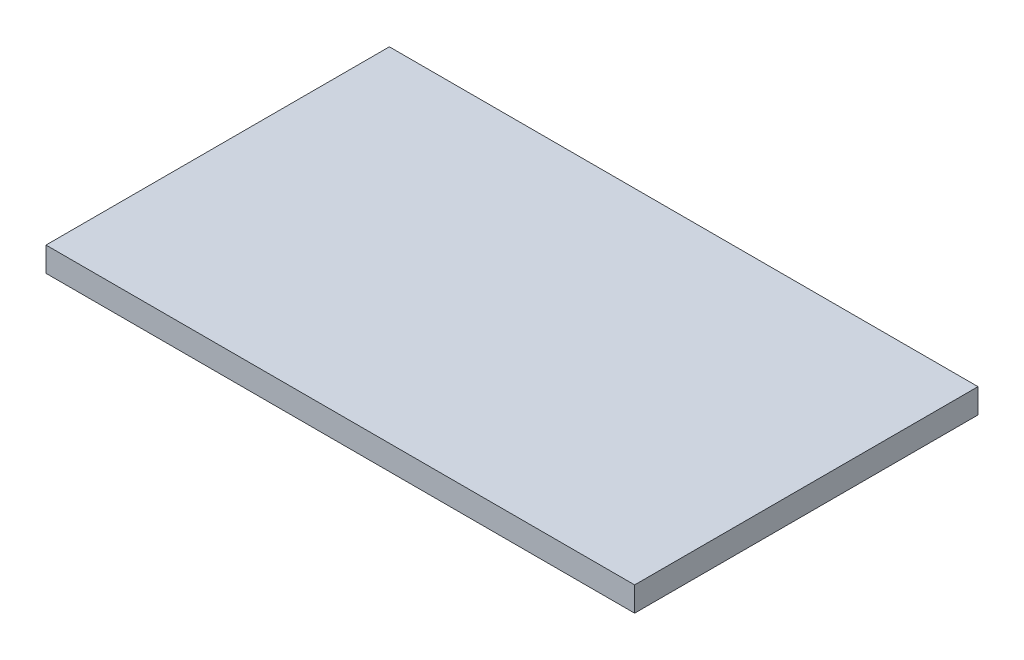
ISO-10303-21;
HEADER;
FILE_DESCRIPTION(('STEP AP214'),'2;1');
FILE_NAME('part.step','',(''),(''),'','','');
FILE_SCHEMA(('AUTOMOTIVE_DESIGN { 1 0 10303 214 1 1 1 1 }'));
ENDSEC;
DATA;
#1=APPLICATION_CONTEXT('core data for automotive mechanical design processes');
#2=APPLICATION_PROTOCOL_DEFINITION('international standard','automotive_design',2000,#1);
#3=PRODUCT_CONTEXT('',#1,'mechanical');
#4=PRODUCT('Part','Part','',(#3));
#5=PRODUCT_RELATED_PRODUCT_CATEGORY('part','',(#4));
#6=PRODUCT_DEFINITION_FORMATION('','',#4);
#7=PRODUCT_DEFINITION_CONTEXT('part definition',#1,'design');
#8=PRODUCT_DEFINITION('design','',#6,#7);
#9=PRODUCT_DEFINITION_SHAPE('','',#8);
#10=(LENGTH_UNIT() NAMED_UNIT(*) SI_UNIT(.MILLI.,.METRE.));
#11=(NAMED_UNIT(*) PLANE_ANGLE_UNIT() SI_UNIT($,.RADIAN.));
#12=(NAMED_UNIT(*) SI_UNIT($,.STERADIAN.) SOLID_ANGLE_UNIT());
#13=UNCERTAINTY_MEASURE_WITH_UNIT(LENGTH_MEASURE(1.E-05),#10,'distance_accuracy_value','');
#14=(GEOMETRIC_REPRESENTATION_CONTEXT(3) GLOBAL_UNCERTAINTY_ASSIGNED_CONTEXT((#13)) GLOBAL_UNIT_ASSIGNED_CONTEXT((#10,
#11,#12)) REPRESENTATION_CONTEXT('',''));
#15=CARTESIAN_POINT('',(0.,0.,0.));
#16=DIRECTION('',(0.,0.,1.));
#17=DIRECTION('',(1.,0.,0.));
#18=AXIS2_PLACEMENT_3D('',#15,#16,#17);
#19=CARTESIAN_POINT('',(0.,5.,0.));
#20=DIRECTION('',(1.,0.,0.));
#21=DIRECTION('',(0.,0.,-1.));
#22=AXIS2_PLACEMENT_3D('',#19,#20,#21);
#23=PLANE('',#22);
#24=DIRECTION('',(0.,0.,1.));
#25=VECTOR('',#24,1.);
#26=CARTESIAN_POINT('',(0.,0.,0.));
#27=LINE('',#26,#25);
#28=CARTESIAN_POINT('',(0.,0.,0.));
#29=VERTEX_POINT('',#28);
#30=CARTESIAN_POINT('',(0.,0.,70.));
#31=VERTEX_POINT('',#30);
#32=EDGE_CURVE('E104',#29,#31,#27,.T.);
#33=ORIENTED_EDGE('',*,*,#32,.T.);
#34=DIRECTION('',(0.,-1.,0.));
#35=VECTOR('',#34,1.);
#36=CARTESIAN_POINT('',(0.,5.,70.));
#37=LINE('',#36,#35);
#38=CARTESIAN_POINT('',(0.,5.,70.));
#39=VERTEX_POINT('',#38);
#40=EDGE_CURVE('E11',#39,#31,#37,.T.);
#41=ORIENTED_EDGE('',*,*,#40,.F.);
#42=DIRECTION('',(0.,0.,1.));
#43=VECTOR('',#42,1.);
#44=CARTESIAN_POINT('',(0.,5.,0.));
#45=LINE('',#44,#43);
#46=CARTESIAN_POINT('',(0.,5.,0.));
#47=VERTEX_POINT('',#46);
#48=EDGE_CURVE('E92',#47,#39,#45,.T.);
#49=ORIENTED_EDGE('',*,*,#48,.F.);
#50=DIRECTION('',(0.,-1.,0.));
#51=VECTOR('',#50,1.);
#52=CARTESIAN_POINT('',(0.,5.,0.));
#53=LINE('',#52,#51);
#54=EDGE_CURVE('E100',#47,#29,#53,.T.);
#55=ORIENTED_EDGE('',*,*,#54,.T.);
#56=EDGE_LOOP('',(#33,#41,#49,#55));
#57=FACE_BOUND('',#56,.T.);
#58=ADVANCED_FACE('F41',(#57),#23,.F.);
#59=CARTESIAN_POINT('',(0.,5.,70.));
#60=DIRECTION('',(0.,0.,-1.));
#61=DIRECTION('',(-1.,0.,0.));
#62=AXIS2_PLACEMENT_3D('',#59,#60,#61);
#63=PLANE('',#62);
#64=DIRECTION('',(1.,0.,0.));
#65=VECTOR('',#64,1.);
#66=CARTESIAN_POINT('',(0.,0.,70.));
#67=LINE('',#66,#65);
#68=CARTESIAN_POINT('',(120.,0.,70.));
#69=VERTEX_POINT('',#68);
#70=EDGE_CURVE('E96',#31,#69,#67,.T.);
#71=ORIENTED_EDGE('',*,*,#70,.T.);
#72=DIRECTION('',(0.,-1.,0.));
#73=VECTOR('',#72,1.);
#74=CARTESIAN_POINT('',(120.,5.,70.));
#75=LINE('',#74,#73);
#76=CARTESIAN_POINT('',(120.,5.,70.));
#77=VERTEX_POINT('',#76);
#78=EDGE_CURVE('E49',#77,#69,#75,.T.);
#79=ORIENTED_EDGE('',*,*,#78,.F.);
#80=DIRECTION('',(1.,0.,0.));
#81=VECTOR('',#80,1.);
#82=CARTESIAN_POINT('',(0.,5.,70.));
#83=LINE('',#82,#81);
#84=EDGE_CURVE('E87',#39,#77,#83,.T.);
#85=ORIENTED_EDGE('',*,*,#84,.F.);
#86=ORIENTED_EDGE('',*,*,#40,.T.);
#87=EDGE_LOOP('',(#71,#79,#85,#86));
#88=FACE_BOUND('',#87,.T.);
#89=ADVANCED_FACE('F95',(#88),#63,.F.);
#90=CARTESIAN_POINT('',(120.,5.,0.));
#91=DIRECTION('',(-1.,0.,0.));
#92=DIRECTION('',(0.,0.,1.));
#93=AXIS2_PLACEMENT_3D('',#90,#91,#92);
#94=PLANE('',#93);
#95=DIRECTION('',(0.,0.,-1.));
#96=VECTOR('',#95,1.);
#97=CARTESIAN_POINT('',(120.,0.,0.));
#98=LINE('',#97,#96);
#99=CARTESIAN_POINT('',(120.,0.,0.));
#100=VERTEX_POINT('',#99);
#101=EDGE_CURVE('E74',#69,#100,#98,.T.);
#102=ORIENTED_EDGE('',*,*,#101,.T.);
#103=DIRECTION('',(0.,-1.,0.));
#104=VECTOR('',#103,1.);
#105=CARTESIAN_POINT('',(120.,5.,0.));
#106=LINE('',#105,#104);
#107=CARTESIAN_POINT('',(120.,5.,0.));
#108=VERTEX_POINT('',#107);
#109=EDGE_CURVE('E97',#108,#100,#106,.T.);
#110=ORIENTED_EDGE('',*,*,#109,.F.);
#111=DIRECTION('',(0.,0.,-1.));
#112=VECTOR('',#111,1.);
#113=CARTESIAN_POINT('',(120.,5.,0.));
#114=LINE('',#113,#112);
#115=EDGE_CURVE('E90',#77,#108,#114,.T.);
#116=ORIENTED_EDGE('',*,*,#115,.F.);
#117=ORIENTED_EDGE('',*,*,#78,.T.);
#118=EDGE_LOOP('',(#102,#110,#116,#117));
#119=FACE_BOUND('',#118,.T.);
#120=ADVANCED_FACE('F98',(#119),#94,.F.);
#121=CARTESIAN_POINT('',(0.,5.,0.));
#122=DIRECTION('',(0.,0.,1.));
#123=DIRECTION('',(1.,0.,0.));
#124=AXIS2_PLACEMENT_3D('',#121,#122,#123);
#125=PLANE('',#124);
#126=DIRECTION('',(-1.,0.,0.));
#127=VECTOR('',#126,1.);
#128=CARTESIAN_POINT('',(0.,0.,0.));
#129=LINE('',#128,#127);
#130=EDGE_CURVE('E80',#100,#29,#129,.T.);
#131=ORIENTED_EDGE('',*,*,#130,.T.);
#132=ORIENTED_EDGE('',*,*,#54,.F.);
#133=DIRECTION('',(-1.,0.,0.));
#134=VECTOR('',#133,1.);
#135=CARTESIAN_POINT('',(0.,5.,0.));
#136=LINE('',#135,#134);
#137=EDGE_CURVE('E57',#108,#47,#136,.T.);
#138=ORIENTED_EDGE('',*,*,#137,.F.);
#139=ORIENTED_EDGE('',*,*,#109,.T.);
#140=EDGE_LOOP('',(#131,#132,#138,#139));
#141=FACE_BOUND('',#140,.T.);
#142=ADVANCED_FACE('F111',(#141),#125,.F.);
#143=CARTESIAN_POINT('',(0.,5.,0.));
#144=DIRECTION('',(0.,1.,0.));
#145=DIRECTION('',(0.,0.,1.));
#146=AXIS2_PLACEMENT_3D('',#143,#144,#145);
#147=PLANE('',#146);
#148=ORIENTED_EDGE('',*,*,#48,.T.);
#149=ORIENTED_EDGE('',*,*,#84,.T.);
#150=ORIENTED_EDGE('',*,*,#115,.T.);
#151=ORIENTED_EDGE('',*,*,#137,.T.);
#152=EDGE_LOOP('',(#148,#149,#150,#151));
#153=FACE_BOUND('',#152,.T.);
#154=ADVANCED_FACE('F88',(#153),#147,.T.);
#155=CARTESIAN_POINT('',(0.,0.,0.));
#156=DIRECTION('',(0.,1.,0.));
#157=DIRECTION('',(0.,0.,1.));
#158=AXIS2_PLACEMENT_3D('',#155,#156,#157);
#159=PLANE('',#158);
#160=ORIENTED_EDGE('',*,*,#32,.F.);
#161=ORIENTED_EDGE('',*,*,#130,.F.);
#162=ORIENTED_EDGE('',*,*,#101,.F.);
#163=ORIENTED_EDGE('',*,*,#70,.F.);
#164=EDGE_LOOP('',(#160,#161,#162,#163));
#165=FACE_BOUND('',#164,.T.);
#166=ADVANCED_FACE('F114',(#165),#159,.F.);
#167=CLOSED_SHELL('',(#58,#89,#120,#142,#154,#166));
#168=MANIFOLD_SOLID_BREP('B2',#167);
#169=ADVANCED_BREP_SHAPE_REPRESENTATION('',(#18,#168),#14);
#170=SHAPE_DEFINITION_REPRESENTATION(#9,#169);
ENDSEC;
END-ISO-10303-21;
